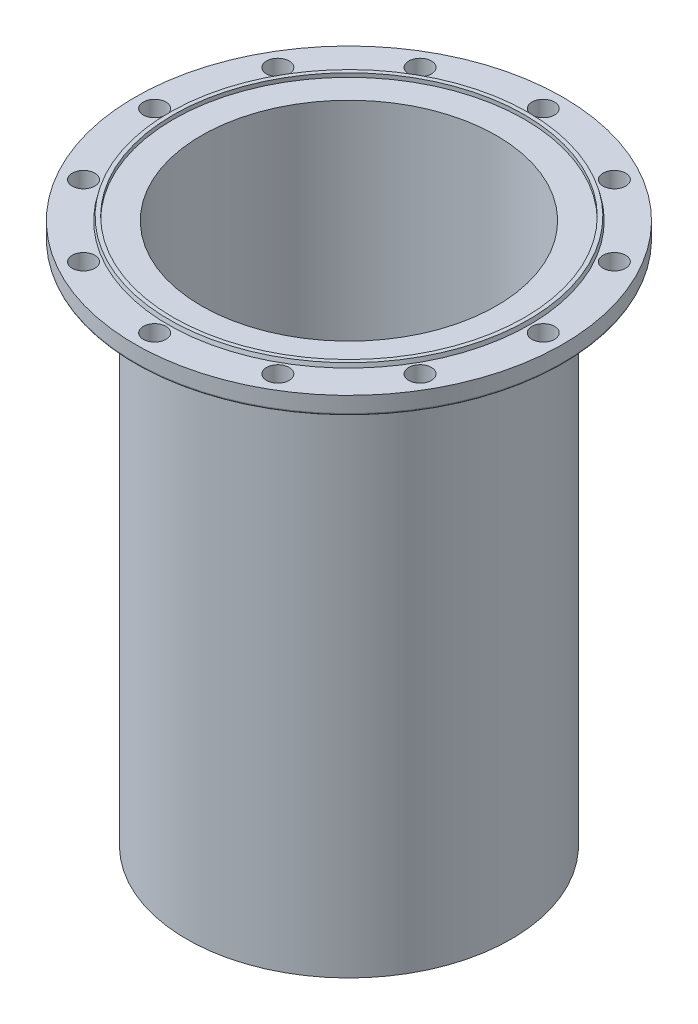
ISO-10303-21;
HEADER;
FILE_DESCRIPTION(('STEP AP214'),'2;1');
FILE_NAME('part.step','',(''),(''),'','','');
FILE_SCHEMA(('AUTOMOTIVE_DESIGN { 1 0 10303 214 1 1 1 1 }'));
ENDSEC;
DATA;
#1=APPLICATION_CONTEXT('core data for automotive mechanical design processes');
#2=APPLICATION_PROTOCOL_DEFINITION('international standard','automotive_design',2000,#1);
#3=PRODUCT_CONTEXT('',#1,'mechanical');
#4=PRODUCT('Part','Part','',(#3));
#5=PRODUCT_RELATED_PRODUCT_CATEGORY('part','',(#4));
#6=PRODUCT_DEFINITION_FORMATION('','',#4);
#7=PRODUCT_DEFINITION_CONTEXT('part definition',#1,'design');
#8=PRODUCT_DEFINITION('design','',#6,#7);
#9=PRODUCT_DEFINITION_SHAPE('','',#8);
#10=(LENGTH_UNIT() NAMED_UNIT(*) SI_UNIT(.MILLI.,.METRE.));
#11=(NAMED_UNIT(*) PLANE_ANGLE_UNIT() SI_UNIT($,.RADIAN.));
#12=(NAMED_UNIT(*) SI_UNIT($,.STERADIAN.) SOLID_ANGLE_UNIT());
#13=UNCERTAINTY_MEASURE_WITH_UNIT(LENGTH_MEASURE(1.E-05),#10,'distance_accuracy_value','');
#14=(GEOMETRIC_REPRESENTATION_CONTEXT(3) GLOBAL_UNCERTAINTY_ASSIGNED_CONTEXT((#13)) GLOBAL_UNIT_ASSIGNED_CONTEXT((#10,
#11,#12)) REPRESENTATION_CONTEXT('',''));
#15=CARTESIAN_POINT('',(0.,0.,0.));
#16=DIRECTION('',(0.,0.,1.));
#17=DIRECTION('',(1.,0.,0.));
#18=AXIS2_PLACEMENT_3D('',#15,#16,#17);
#19=CARTESIAN_POINT('',(-5.28893934632307,-9.28872093023256,0.));
#20=DIRECTION('',(0.,-1.,0.));
#21=DIRECTION('',(0.,0.,-1.));
#22=AXIS2_PLACEMENT_3D('',#19,#20,#21);
#23=CYLINDRICAL_SURFACE('',#22,150.);
#24=CARTESIAN_POINT('',(-5.28893934632307,40.7112790697674,0.));
#25=DIRECTION('',(0.,-1.,0.));
#26=DIRECTION('',(0.,0.,-1.));
#27=AXIS2_PLACEMENT_3D('',#24,#25,#26);
#28=CIRCLE('',#27,150.);
#29=CARTESIAN_POINT('',(-5.28893934632307,40.7112790697674,-150.));
#30=VERTEX_POINT('',#29);
#31=EDGE_CURVE('E10',#30,#30,#28,.T.);
#32=ORIENTED_EDGE('',*,*,#31,.F.);
#33=EDGE_LOOP('',(#32));
#34=FACE_BOUND('',#33,.T.);
#35=CARTESIAN_POINT('',(-5.28893934632307,-509.288720930233,0.));
#36=DIRECTION('',(0.,-1.,0.));
#37=DIRECTION('',(0.,0.,-1.));
#38=AXIS2_PLACEMENT_3D('',#35,#36,#37);
#39=CIRCLE('',#38,150.);
#40=CARTESIAN_POINT('',(-5.28893934632307,-509.288720930233,-150.));
#41=VERTEX_POINT('',#40);
#42=EDGE_CURVE('E256',#41,#41,#39,.T.);
#43=ORIENTED_EDGE('',*,*,#42,.T.);
#44=EDGE_LOOP('',(#43));
#45=FACE_BOUND('',#44,.T.);
#46=ADVANCED_FACE('F33',(#34,#45),#23,.F.);
#47=CARTESIAN_POINT('',(-155.288939346323,40.7112790697674,0.));
#48=DIRECTION('',(0.,-1.,0.));
#49=DIRECTION('',(0.,0.,-1.));
#50=AXIS2_PLACEMENT_3D('',#47,#48,#49);
#51=PLANE('',#50);
#52=CARTESIAN_POINT('',(-5.28893934632307,40.7112790697674,0.));
#53=DIRECTION('',(0.,-1.,0.));
#54=DIRECTION('',(0.,0.,-1.));
#55=AXIS2_PLACEMENT_3D('',#52,#53,#54);
#56=CIRCLE('',#55,178.5);
#57=CARTESIAN_POINT('',(-5.28893934632307,40.7112790697674,-178.5));
#58=VERTEX_POINT('',#57);
#59=EDGE_CURVE('E40',#58,#58,#56,.T.);
#60=ORIENTED_EDGE('',*,*,#59,.F.);
#61=EDGE_LOOP('',(#60));
#62=FACE_BOUND('',#61,.T.);
#63=ORIENTED_EDGE('',*,*,#31,.T.);
#64=EDGE_LOOP('',(#63));
#65=FACE_BOUND('',#64,.T.);
#66=ADVANCED_FACE('F153',(#62,#65),#51,.F.);
#67=CARTESIAN_POINT('',(-5.28893934632307,-9.28872093023256,0.));
#68=DIRECTION('',(0.,-1.,0.));
#69=DIRECTION('',(0.,0.,-1.));
#70=AXIS2_PLACEMENT_3D('',#67,#68,#69);
#71=CYLINDRICAL_SURFACE('',#70,178.5);
#72=CARTESIAN_POINT('',(-5.28893934632307,44.7112790697674,0.));
#73=DIRECTION('',(0.,-1.,0.));
#74=DIRECTION('',(0.,0.,-1.));
#75=AXIS2_PLACEMENT_3D('',#72,#73,#74);
#76=CIRCLE('',#75,178.5);
#77=CARTESIAN_POINT('',(-5.28893934632307,44.7112790697674,-178.5));
#78=VERTEX_POINT('',#77);
#79=EDGE_CURVE('E45',#78,#78,#76,.T.);
#80=ORIENTED_EDGE('',*,*,#79,.F.);
#81=EDGE_LOOP('',(#80));
#82=FACE_BOUND('',#81,.T.);
#83=ORIENTED_EDGE('',*,*,#59,.T.);
#84=EDGE_LOOP('',(#83));
#85=FACE_BOUND('',#84,.T.);
#86=ADVANCED_FACE('F150',(#82,#85),#71,.F.);
#87=CARTESIAN_POINT('',(-183.788939346323,44.7112790697674,0.));
#88=DIRECTION('',(0.,-1.,0.));
#89=DIRECTION('',(0.,0.,-1.));
#90=AXIS2_PLACEMENT_3D('',#87,#88,#89);
#91=PLANE('',#90);
#92=CARTESIAN_POINT('',(-5.28893934632307,44.7112790697674,0.));
#93=DIRECTION('',(0.,-1.,0.));
#94=DIRECTION('',(0.,0.,-1.));
#95=AXIS2_PLACEMENT_3D('',#92,#93,#94);
#96=CIRCLE('',#95,182.5);
#97=CARTESIAN_POINT('',(-5.28893934632307,44.7112790697674,-182.5));
#98=VERTEX_POINT('',#97);
#99=EDGE_CURVE('E143',#98,#98,#96,.T.);
#100=ORIENTED_EDGE('',*,*,#99,.F.);
#101=EDGE_LOOP('',(#100));
#102=FACE_BOUND('',#101,.T.);
#103=ORIENTED_EDGE('',*,*,#79,.T.);
#104=EDGE_LOOP('',(#103));
#105=FACE_BOUND('',#104,.T.);
#106=ADVANCED_FACE('F148',(#102,#105),#91,.F.);
#107=CARTESIAN_POINT('',(-5.28893934632307,44.7112790697674,0.));
#108=DIRECTION('',(0.,-1.,0.));
#109=DIRECTION('',(0.,0.,-1.));
#110=AXIS2_PLACEMENT_3D('',#107,#108,#109);
#111=CONICAL_SURFACE('',#110,182.5,0.244978663126865);
#112=CARTESIAN_POINT('',(-5.28893934632307,40.7112790697674,0.));
#113=DIRECTION('',(0.,-1.,0.));
#114=DIRECTION('',(0.,0.,-1.));
#115=AXIS2_PLACEMENT_3D('',#112,#113,#114);
#116=CIRCLE('',#115,183.5);
#117=CARTESIAN_POINT('',(-5.28893934632307,40.7112790697674,-183.5));
#118=VERTEX_POINT('',#117);
#119=EDGE_CURVE('E140',#118,#118,#116,.T.);
#120=ORIENTED_EDGE('',*,*,#119,.F.);
#121=EDGE_LOOP('',(#120));
#122=FACE_BOUND('',#121,.T.);
#123=ORIENTED_EDGE('',*,*,#99,.T.);
#124=EDGE_LOOP('',(#123));
#125=FACE_BOUND('',#124,.T.);
#126=ADVANCED_FACE('F165',(#122,#125),#111,.T.);
#127=CARTESIAN_POINT('',(-188.788939346323,40.7112790697674,0.));
#128=DIRECTION('',(0.,-1.,0.));
#129=DIRECTION('',(0.,0.,-1.));
#130=AXIS2_PLACEMENT_3D('',#127,#128,#129);
#131=PLANE('',#130);
#132=CARTESIAN_POINT('',(-176.32895659375,40.7112790697674,98.7500000000002));
#133=DIRECTION('',(0.,1.,0.));
#134=DIRECTION('',(0.,0.,1.));
#135=AXIS2_PLACEMENT_3D('',#132,#133,#134);
#136=CIRCLE('',#135,11.5);
#137=CARTESIAN_POINT('',(-176.32895659375,40.7112790697674,110.25));
#138=VERTEX_POINT('',#137);
#139=EDGE_CURVE('E101',#138,#138,#136,.T.);
#140=ORIENTED_EDGE('',*,*,#139,.F.);
#141=EDGE_LOOP('',(#140));
#142=FACE_BOUND('',#141,.T.);
#143=CARTESIAN_POINT('',(-104.038939346323,40.7112790697674,171.040017247427));
#144=DIRECTION('',(0.,1.,0.));
#145=DIRECTION('',(0.,0.,1.));
#146=AXIS2_PLACEMENT_3D('',#143,#144,#145);
#147=CIRCLE('',#146,11.5);
#148=CARTESIAN_POINT('',(-104.038939346323,40.7112790697674,182.540017247427));
#149=VERTEX_POINT('',#148);
#150=EDGE_CURVE('E91',#149,#149,#147,.T.);
#151=ORIENTED_EDGE('',*,*,#150,.F.);
#152=EDGE_LOOP('',(#151));
#153=FACE_BOUND('',#152,.T.);
#154=CARTESIAN_POINT('',(-5.28893934632304,40.7112790697674,197.5));
#155=DIRECTION('',(0.,1.,0.));
#156=DIRECTION('',(0.,0.,1.));
#157=AXIS2_PLACEMENT_3D('',#154,#155,#156);
#158=CIRCLE('',#157,11.5);
#159=CARTESIAN_POINT('',(-5.28893934632304,40.7112790697674,209.));
#160=VERTEX_POINT('',#159);
#161=EDGE_CURVE('E88',#160,#160,#158,.T.);
#162=ORIENTED_EDGE('',*,*,#161,.F.);
#163=EDGE_LOOP('',(#162));
#164=FACE_BOUND('',#163,.T.);
#165=CARTESIAN_POINT('',(93.461060653677,40.7112790697674,171.040017247427));
#166=DIRECTION('',(0.,1.,0.));
#167=DIRECTION('',(0.,0.,1.));
#168=AXIS2_PLACEMENT_3D('',#165,#166,#167);
#169=CIRCLE('',#168,11.5);
#170=CARTESIAN_POINT('',(93.461060653677,40.7112790697674,182.540017247427));
#171=VERTEX_POINT('',#170);
#172=EDGE_CURVE('E85',#171,#171,#169,.T.);
#173=ORIENTED_EDGE('',*,*,#172,.F.);
#174=EDGE_LOOP('',(#173));
#175=FACE_BOUND('',#174,.T.);
#176=CARTESIAN_POINT('',(165.751077901104,40.7112790697674,98.75));
#177=DIRECTION('',(0.,1.,0.));
#178=DIRECTION('',(0.,0.,1.));
#179=AXIS2_PLACEMENT_3D('',#176,#177,#178);
#180=CIRCLE('',#179,11.5);
#181=CARTESIAN_POINT('',(165.751077901104,40.7112790697674,110.25));
#182=VERTEX_POINT('',#181);
#183=EDGE_CURVE('E81',#182,#182,#180,.T.);
#184=ORIENTED_EDGE('',*,*,#183,.F.);
#185=EDGE_LOOP('',(#184));
#186=FACE_BOUND('',#185,.T.);
#187=CARTESIAN_POINT('',(192.211060653677,40.7112790697674,0.));
#188=DIRECTION('',(0.,1.,0.));
#189=DIRECTION('',(0.,0.,1.));
#190=AXIS2_PLACEMENT_3D('',#187,#188,#189);
#191=CIRCLE('',#190,11.5);
#192=CARTESIAN_POINT('',(192.211060653677,40.7112790697674,11.5));
#193=VERTEX_POINT('',#192);
#194=EDGE_CURVE('E77',#193,#193,#191,.T.);
#195=ORIENTED_EDGE('',*,*,#194,.F.);
#196=EDGE_LOOP('',(#195));
#197=FACE_BOUND('',#196,.T.);
#198=CARTESIAN_POINT('',(165.751077901104,40.7112790697674,-98.75));
#199=DIRECTION('',(0.,1.,0.));
#200=DIRECTION('',(0.,0.,1.));
#201=AXIS2_PLACEMENT_3D('',#198,#199,#200);
#202=CIRCLE('',#201,11.5);
#203=CARTESIAN_POINT('',(165.751077901104,40.7112790697674,-87.25));
#204=VERTEX_POINT('',#203);
#205=EDGE_CURVE('E73',#204,#204,#202,.T.);
#206=ORIENTED_EDGE('',*,*,#205,.F.);
#207=EDGE_LOOP('',(#206));
#208=FACE_BOUND('',#207,.T.);
#209=CARTESIAN_POINT('',(-5.28893934632309,40.7112790697674,-197.5));
#210=DIRECTION('',(0.,1.,0.));
#211=DIRECTION('',(0.,0.,1.));
#212=AXIS2_PLACEMENT_3D('',#209,#210,#211);
#213=CIRCLE('',#212,11.5);
#214=CARTESIAN_POINT('',(-5.28893934632309,40.7112790697674,-186.));
#215=VERTEX_POINT('',#214);
#216=EDGE_CURVE('E69',#215,#215,#213,.T.);
#217=ORIENTED_EDGE('',*,*,#216,.F.);
#218=EDGE_LOOP('',(#217));
#219=FACE_BOUND('',#218,.T.);
#220=CARTESIAN_POINT('',(-104.038939346323,40.7112790697674,-171.040017247427));
#221=DIRECTION('',(0.,1.,0.));
#222=DIRECTION('',(0.,0.,1.));
#223=AXIS2_PLACEMENT_3D('',#220,#221,#222);
#224=CIRCLE('',#223,11.5);
#225=CARTESIAN_POINT('',(-104.038939346323,40.7112790697674,-159.540017247427));
#226=VERTEX_POINT('',#225);
#227=EDGE_CURVE('E65',#226,#226,#224,.T.);
#228=ORIENTED_EDGE('',*,*,#227,.F.);
#229=EDGE_LOOP('',(#228));
#230=FACE_BOUND('',#229,.T.);
#231=CARTESIAN_POINT('',(-176.32895659375,40.7112790697674,-98.75));
#232=DIRECTION('',(0.,1.,0.));
#233=DIRECTION('',(0.,0.,1.));
#234=AXIS2_PLACEMENT_3D('',#231,#232,#233);
#235=CIRCLE('',#234,11.5);
#236=CARTESIAN_POINT('',(-176.32895659375,40.7112790697674,-87.25));
#237=VERTEX_POINT('',#236);
#238=EDGE_CURVE('E61',#237,#237,#235,.T.);
#239=ORIENTED_EDGE('',*,*,#238,.F.);
#240=EDGE_LOOP('',(#239));
#241=FACE_BOUND('',#240,.T.);
#242=CARTESIAN_POINT('',(93.4610606536769,40.7112790697674,-171.040017247427));
#243=DIRECTION('',(0.,1.,0.));
#244=DIRECTION('',(0.,0.,1.));
#245=AXIS2_PLACEMENT_3D('',#242,#243,#244);
#246=CIRCLE('',#245,11.5);
#247=CARTESIAN_POINT('',(93.4610606536769,40.7112790697674,-159.540017247427));
#248=VERTEX_POINT('',#247);
#249=EDGE_CURVE('E57',#248,#248,#246,.T.);
#250=ORIENTED_EDGE('',*,*,#249,.F.);
#251=EDGE_LOOP('',(#250));
#252=FACE_BOUND('',#251,.T.);
#253=CARTESIAN_POINT('',(-202.788939346323,40.7112790697674,0.));
#254=DIRECTION('',(0.,1.,0.));
#255=DIRECTION('',(0.,0.,1.));
#256=AXIS2_PLACEMENT_3D('',#253,#254,#255);
#257=CIRCLE('',#256,11.5);
#258=CARTESIAN_POINT('',(-202.788939346323,40.7112790697674,11.5000000000001));
#259=VERTEX_POINT('',#258);
#260=EDGE_CURVE('E53',#259,#259,#257,.T.);
#261=ORIENTED_EDGE('',*,*,#260,.F.);
#262=EDGE_LOOP('',(#261));
#263=FACE_BOUND('',#262,.T.);
#264=CARTESIAN_POINT('',(-5.28893934632307,40.7112790697674,0.));
#265=DIRECTION('',(0.,-1.,0.));
#266=DIRECTION('',(0.,0.,-1.));
#267=AXIS2_PLACEMENT_3D('',#264,#265,#266);
#268=CIRCLE('',#267,217.5);
#269=CARTESIAN_POINT('',(-5.28893934632307,40.7112790697674,-217.5));
#270=VERTEX_POINT('',#269);
#271=EDGE_CURVE('E137',#270,#270,#268,.T.);
#272=ORIENTED_EDGE('',*,*,#271,.F.);
#273=EDGE_LOOP('',(#272));
#274=FACE_BOUND('',#273,.T.);
#275=ORIENTED_EDGE('',*,*,#119,.T.);
#276=EDGE_LOOP('',(#275));
#277=FACE_BOUND('',#276,.T.);
#278=ADVANCED_FACE('F169',(#142,#153,#164,#175,#186,#197,#208,#219,#230,#241,#252,#263,#274,
#277),#131,.F.);
#279=CARTESIAN_POINT('',(-5.28893934632307,-9.28872093023256,0.));
#280=DIRECTION('',(0.,-1.,0.));
#281=DIRECTION('',(0.,0.,-1.));
#282=AXIS2_PLACEMENT_3D('',#279,#280,#281);
#283=CYLINDRICAL_SURFACE('',#282,217.5);
#284=CARTESIAN_POINT('',(-5.28893934632307,24.7112790697674,0.));
#285=DIRECTION('',(0.,-1.,0.));
#286=DIRECTION('',(0.,0.,-1.));
#287=AXIS2_PLACEMENT_3D('',#284,#285,#286);
#288=CIRCLE('',#287,217.5);
#289=CARTESIAN_POINT('',(-5.28893934632307,24.7112790697674,-217.5));
#290=VERTEX_POINT('',#289);
#291=EDGE_CURVE('E134',#290,#290,#288,.T.);
#292=ORIENTED_EDGE('',*,*,#291,.F.);
#293=EDGE_LOOP('',(#292));
#294=FACE_BOUND('',#293,.T.);
#295=ORIENTED_EDGE('',*,*,#271,.T.);
#296=EDGE_LOOP('',(#295));
#297=FACE_BOUND('',#296,.T.);
#298=ADVANCED_FACE('F173',(#294,#297),#283,.T.);
#299=CARTESIAN_POINT('',(-5.28893934632307,24.7112790697674,0.));
#300=DIRECTION('',(0.,-1.,0.));
#301=DIRECTION('',(0.,0.,-1.));
#302=AXIS2_PLACEMENT_3D('',#299,#300,#301);
#303=TOROIDAL_SURFACE('',#302,215.5,2.00000000000001);
#304=CARTESIAN_POINT('',(-5.28893934632307,22.7112790697674,0.));
#305=DIRECTION('',(0.,-1.,0.));
#306=DIRECTION('',(0.,0.,-1.));
#307=AXIS2_PLACEMENT_3D('',#304,#305,#306);
#308=CIRCLE('',#307,215.5);
#309=CARTESIAN_POINT('',(-5.28893934632307,22.7112790697674,-215.5));
#310=VERTEX_POINT('',#309);
#311=EDGE_CURVE('E131',#310,#310,#308,.T.);
#312=ORIENTED_EDGE('',*,*,#311,.F.);
#313=EDGE_LOOP('',(#312));
#314=FACE_BOUND('',#313,.T.);
#315=ORIENTED_EDGE('',*,*,#291,.T.);
#316=EDGE_LOOP('',(#315));
#317=FACE_BOUND('',#316,.T.);
#318=ADVANCED_FACE('F177',(#314,#317),#303,.T.);
#319=CARTESIAN_POINT('',(-220.788939346323,22.7112790697674,0.));
#320=DIRECTION('',(0.,1.,0.));
#321=DIRECTION('',(0.,0.,1.));
#322=AXIS2_PLACEMENT_3D('',#319,#320,#321);
#323=PLANE('',#322);
#324=CARTESIAN_POINT('',(-176.32895659375,22.7112790697674,98.7500000000002));
#325=DIRECTION('',(0.,1.,0.));
#326=DIRECTION('',(0.,0.,1.));
#327=AXIS2_PLACEMENT_3D('',#324,#325,#326);
#328=CIRCLE('',#327,11.5);
#329=CARTESIAN_POINT('',(-176.32895659375,22.7112790697674,110.25));
#330=VERTEX_POINT('',#329);
#331=EDGE_CURVE('E36',#330,#330,#328,.T.);
#332=ORIENTED_EDGE('',*,*,#331,.T.);
#333=EDGE_LOOP('',(#332));
#334=FACE_BOUND('',#333,.T.);
#335=CARTESIAN_POINT('',(-104.038939346323,22.7112790697674,171.040017247427));
#336=DIRECTION('',(0.,1.,0.));
#337=DIRECTION('',(0.,0.,1.));
#338=AXIS2_PLACEMENT_3D('',#335,#336,#337);
#339=CIRCLE('',#338,11.5);
#340=CARTESIAN_POINT('',(-104.038939346323,22.7112790697674,182.540017247427));
#341=VERTEX_POINT('',#340);
#342=EDGE_CURVE('E89',#341,#341,#339,.T.);
#343=ORIENTED_EDGE('',*,*,#342,.T.);
#344=EDGE_LOOP('',(#343));
#345=FACE_BOUND('',#344,.T.);
#346=CARTESIAN_POINT('',(-5.28893934632304,22.7112790697674,197.5));
#347=DIRECTION('',(0.,1.,0.));
#348=DIRECTION('',(0.,0.,1.));
#349=AXIS2_PLACEMENT_3D('',#346,#347,#348);
#350=CIRCLE('',#349,11.5);
#351=CARTESIAN_POINT('',(-5.28893934632304,22.7112790697674,209.));
#352=VERTEX_POINT('',#351);
#353=EDGE_CURVE('E86',#352,#352,#350,.T.);
#354=ORIENTED_EDGE('',*,*,#353,.T.);
#355=EDGE_LOOP('',(#354));
#356=FACE_BOUND('',#355,.T.);
#357=CARTESIAN_POINT('',(93.461060653677,22.7112790697674,171.040017247427));
#358=DIRECTION('',(0.,1.,0.));
#359=DIRECTION('',(0.,0.,1.));
#360=AXIS2_PLACEMENT_3D('',#357,#358,#359);
#361=CIRCLE('',#360,11.5);
#362=CARTESIAN_POINT('',(93.461060653677,22.7112790697674,182.540017247427));
#363=VERTEX_POINT('',#362);
#364=EDGE_CURVE('E82',#363,#363,#361,.T.);
#365=ORIENTED_EDGE('',*,*,#364,.T.);
#366=EDGE_LOOP('',(#365));
#367=FACE_BOUND('',#366,.T.);
#368=CARTESIAN_POINT('',(165.751077901104,22.7112790697674,98.75));
#369=DIRECTION('',(0.,1.,0.));
#370=DIRECTION('',(0.,0.,1.));
#371=AXIS2_PLACEMENT_3D('',#368,#369,#370);
#372=CIRCLE('',#371,11.5);
#373=CARTESIAN_POINT('',(165.751077901104,22.7112790697674,110.25));
#374=VERTEX_POINT('',#373);
#375=EDGE_CURVE('E78',#374,#374,#372,.T.);
#376=ORIENTED_EDGE('',*,*,#375,.T.);
#377=EDGE_LOOP('',(#376));
#378=FACE_BOUND('',#377,.T.);
#379=CARTESIAN_POINT('',(192.211060653677,22.7112790697674,0.));
#380=DIRECTION('',(0.,1.,0.));
#381=DIRECTION('',(0.,0.,1.));
#382=AXIS2_PLACEMENT_3D('',#379,#380,#381);
#383=CIRCLE('',#382,11.5);
#384=CARTESIAN_POINT('',(192.211060653677,22.7112790697674,11.5));
#385=VERTEX_POINT('',#384);
#386=EDGE_CURVE('E74',#385,#385,#383,.T.);
#387=ORIENTED_EDGE('',*,*,#386,.T.);
#388=EDGE_LOOP('',(#387));
#389=FACE_BOUND('',#388,.T.);
#390=CARTESIAN_POINT('',(165.751077901104,22.7112790697674,-98.75));
#391=DIRECTION('',(0.,1.,0.));
#392=DIRECTION('',(0.,0.,1.));
#393=AXIS2_PLACEMENT_3D('',#390,#391,#392);
#394=CIRCLE('',#393,11.5);
#395=CARTESIAN_POINT('',(165.751077901104,22.7112790697674,-87.25));
#396=VERTEX_POINT('',#395);
#397=EDGE_CURVE('E70',#396,#396,#394,.T.);
#398=ORIENTED_EDGE('',*,*,#397,.T.);
#399=EDGE_LOOP('',(#398));
#400=FACE_BOUND('',#399,.T.);
#401=CARTESIAN_POINT('',(-5.28893934632309,22.7112790697674,-197.5));
#402=DIRECTION('',(0.,1.,0.));
#403=DIRECTION('',(0.,0.,1.));
#404=AXIS2_PLACEMENT_3D('',#401,#402,#403);
#405=CIRCLE('',#404,11.5);
#406=CARTESIAN_POINT('',(-5.28893934632309,22.7112790697674,-186.));
#407=VERTEX_POINT('',#406);
#408=EDGE_CURVE('E66',#407,#407,#405,.T.);
#409=ORIENTED_EDGE('',*,*,#408,.T.);
#410=EDGE_LOOP('',(#409));
#411=FACE_BOUND('',#410,.T.);
#412=CARTESIAN_POINT('',(-104.038939346323,22.7112790697674,-171.040017247427));
#413=DIRECTION('',(0.,1.,0.));
#414=DIRECTION('',(0.,0.,1.));
#415=AXIS2_PLACEMENT_3D('',#412,#413,#414);
#416=CIRCLE('',#415,11.5);
#417=CARTESIAN_POINT('',(-104.038939346323,22.7112790697674,-159.540017247427));
#418=VERTEX_POINT('',#417);
#419=EDGE_CURVE('E62',#418,#418,#416,.T.);
#420=ORIENTED_EDGE('',*,*,#419,.T.);
#421=EDGE_LOOP('',(#420));
#422=FACE_BOUND('',#421,.T.);
#423=CARTESIAN_POINT('',(-176.32895659375,22.7112790697674,-98.75));
#424=DIRECTION('',(0.,1.,0.));
#425=DIRECTION('',(0.,0.,1.));
#426=AXIS2_PLACEMENT_3D('',#423,#424,#425);
#427=CIRCLE('',#426,11.5);
#428=CARTESIAN_POINT('',(-176.32895659375,22.7112790697674,-87.25));
#429=VERTEX_POINT('',#428);
#430=EDGE_CURVE('E58',#429,#429,#427,.T.);
#431=ORIENTED_EDGE('',*,*,#430,.T.);
#432=EDGE_LOOP('',(#431));
#433=FACE_BOUND('',#432,.T.);
#434=CARTESIAN_POINT('',(93.4610606536769,22.7112790697674,-171.040017247427));
#435=DIRECTION('',(0.,1.,0.));
#436=DIRECTION('',(0.,0.,1.));
#437=AXIS2_PLACEMENT_3D('',#434,#435,#436);
#438=CIRCLE('',#437,11.5);
#439=CARTESIAN_POINT('',(93.4610606536769,22.7112790697674,-159.540017247427));
#440=VERTEX_POINT('',#439);
#441=EDGE_CURVE('E54',#440,#440,#438,.T.);
#442=ORIENTED_EDGE('',*,*,#441,.T.);
#443=EDGE_LOOP('',(#442));
#444=FACE_BOUND('',#443,.T.);
#445=CARTESIAN_POINT('',(-202.788939346323,22.7112790697674,0.));
#446=DIRECTION('',(0.,1.,0.));
#447=DIRECTION('',(0.,0.,1.));
#448=AXIS2_PLACEMENT_3D('',#445,#446,#447);
#449=CIRCLE('',#448,11.5);
#450=CARTESIAN_POINT('',(-202.788939346323,22.7112790697674,11.5000000000001));
#451=VERTEX_POINT('',#450);
#452=EDGE_CURVE('E49',#451,#451,#449,.T.);
#453=ORIENTED_EDGE('',*,*,#452,.T.);
#454=EDGE_LOOP('',(#453));
#455=FACE_BOUND('',#454,.T.);
#456=CARTESIAN_POINT('',(-5.28893934632307,22.7112790697674,0.));
#457=DIRECTION('',(0.,-1.,0.));
#458=DIRECTION('',(0.,0.,-1.));
#459=AXIS2_PLACEMENT_3D('',#456,#457,#458);
#460=CIRCLE('',#459,175.991183949057);
#461=CARTESIAN_POINT('',(-5.28893934632307,22.7112790697674,-175.991183949057));
#462=VERTEX_POINT('',#461);
#463=EDGE_CURVE('E128',#462,#462,#460,.T.);
#464=ORIENTED_EDGE('',*,*,#463,.F.);
#465=EDGE_LOOP('',(#464));
#466=FACE_BOUND('',#465,.T.);
#467=ORIENTED_EDGE('',*,*,#311,.T.);
#468=EDGE_LOOP('',(#467));
#469=FACE_BOUND('',#468,.T.);
#470=ADVANCED_FACE('F181',(#334,#345,#356,#367,#378,#389,#400,#411,#422,#433,#444,#455,#466,
#469),#323,.F.);
#471=CARTESIAN_POINT('',(-5.28893934632307,15.7112790697674,0.));
#472=DIRECTION('',(0.,-1.,0.));
#473=DIRECTION('',(0.,0.,-1.));
#474=AXIS2_PLACEMENT_3D('',#471,#472,#473);
#475=TOROIDAL_SURFACE('',#474,175.991183949057,6.99999999999999);
#476=CARTESIAN_POINT('',(-5.28893934632307,16.7919172316827,0.));
#477=DIRECTION('',(0.,-1.,0.));
#478=DIRECTION('',(0.,0.,-1.));
#479=AXIS2_PLACEMENT_3D('',#476,#477,#478);
#480=CIRCLE('',#479,169.075099712799);
#481=CARTESIAN_POINT('',(-5.28893934632307,16.7919172316827,-169.075099712799));
#482=VERTEX_POINT('',#481);
#483=EDGE_CURVE('E125',#482,#482,#480,.T.);
#484=ORIENTED_EDGE('',*,*,#483,.F.);
#485=EDGE_LOOP('',(#484));
#486=FACE_BOUND('',#485,.T.);
#487=ORIENTED_EDGE('',*,*,#463,.T.);
#488=EDGE_LOOP('',(#487));
#489=FACE_BOUND('',#488,.T.);
#490=ADVANCED_FACE('F185',(#486,#489),#475,.F.);
#491=CARTESIAN_POINT('',(-5.28893934632307,16.7919172316827,0.));
#492=DIRECTION('',(0.,1.,0.));
#493=DIRECTION('',(0.,0.,1.));
#494=AXIS2_PLACEMENT_3D('',#491,#492,#493);
#495=CONICAL_SURFACE('',#494,169.075099712799,0.154996741923942);
#496=CARTESIAN_POINT('',(-5.28893934632307,-9.28872093023256,0.));
#497=DIRECTION('',(0.,-1.,0.));
#498=DIRECTION('',(0.,0.,-1.));
#499=AXIS2_PLACEMENT_3D('',#496,#497,#498);
#500=CIRCLE('',#499,165.);
#501=CARTESIAN_POINT('',(-5.28893934632307,-9.28872093023256,-165.));
#502=VERTEX_POINT('',#501);
#503=EDGE_CURVE('E52',#502,#502,#500,.T.);
#504=ORIENTED_EDGE('',*,*,#503,.F.);
#505=EDGE_LOOP('',(#504));
#506=FACE_BOUND('',#505,.T.);
#507=ORIENTED_EDGE('',*,*,#483,.T.);
#508=EDGE_LOOP('',(#507));
#509=FACE_BOUND('',#508,.T.);
#510=ADVANCED_FACE('F189',(#506,#509),#495,.T.);
#511=CARTESIAN_POINT('',(-202.788939346323,-9.28872093023256,0.));
#512=DIRECTION('',(0.,1.,0.));
#513=DIRECTION('',(0.,0.,1.));
#514=AXIS2_PLACEMENT_3D('',#511,#512,#513);
#515=CYLINDRICAL_SURFACE('',#514,11.5);
#516=ORIENTED_EDGE('',*,*,#260,.T.);
#517=EDGE_LOOP('',(#516));
#518=FACE_BOUND('',#517,.T.);
#519=ORIENTED_EDGE('',*,*,#452,.F.);
#520=EDGE_LOOP('',(#519));
#521=FACE_BOUND('',#520,.T.);
#522=ADVANCED_FACE('F193',(#518,#521),#515,.F.);
#523=CARTESIAN_POINT('',(93.4610606536769,-9.28872093023256,-171.040017247427));
#524=DIRECTION('',(0.,1.,0.));
#525=DIRECTION('',(0.,0.,1.));
#526=AXIS2_PLACEMENT_3D('',#523,#524,#525);
#527=CYLINDRICAL_SURFACE('',#526,11.5);
#528=ORIENTED_EDGE('',*,*,#249,.T.);
#529=EDGE_LOOP('',(#528));
#530=FACE_BOUND('',#529,.T.);
#531=ORIENTED_EDGE('',*,*,#441,.F.);
#532=EDGE_LOOP('',(#531));
#533=FACE_BOUND('',#532,.T.);
#534=ADVANCED_FACE('F197',(#530,#533),#527,.F.);
#535=CARTESIAN_POINT('',(-176.32895659375,-9.28872093023256,-98.75));
#536=DIRECTION('',(0.,1.,0.));
#537=DIRECTION('',(0.,0.,1.));
#538=AXIS2_PLACEMENT_3D('',#535,#536,#537);
#539=CYLINDRICAL_SURFACE('',#538,11.5);
#540=ORIENTED_EDGE('',*,*,#238,.T.);
#541=EDGE_LOOP('',(#540));
#542=FACE_BOUND('',#541,.T.);
#543=ORIENTED_EDGE('',*,*,#430,.F.);
#544=EDGE_LOOP('',(#543));
#545=FACE_BOUND('',#544,.T.);
#546=ADVANCED_FACE('F201',(#542,#545),#539,.F.);
#547=CARTESIAN_POINT('',(-104.038939346323,-9.28872093023256,-171.040017247427));
#548=DIRECTION('',(0.,1.,0.));
#549=DIRECTION('',(0.,0.,1.));
#550=AXIS2_PLACEMENT_3D('',#547,#548,#549);
#551=CYLINDRICAL_SURFACE('',#550,11.5);
#552=ORIENTED_EDGE('',*,*,#227,.T.);
#553=EDGE_LOOP('',(#552));
#554=FACE_BOUND('',#553,.T.);
#555=ORIENTED_EDGE('',*,*,#419,.F.);
#556=EDGE_LOOP('',(#555));
#557=FACE_BOUND('',#556,.T.);
#558=ADVANCED_FACE('F205',(#554,#557),#551,.F.);
#559=CARTESIAN_POINT('',(-5.28893934632309,-9.28872093023256,-197.5));
#560=DIRECTION('',(0.,1.,0.));
#561=DIRECTION('',(0.,0.,1.));
#562=AXIS2_PLACEMENT_3D('',#559,#560,#561);
#563=CYLINDRICAL_SURFACE('',#562,11.5);
#564=ORIENTED_EDGE('',*,*,#216,.T.);
#565=EDGE_LOOP('',(#564));
#566=FACE_BOUND('',#565,.T.);
#567=ORIENTED_EDGE('',*,*,#408,.F.);
#568=EDGE_LOOP('',(#567));
#569=FACE_BOUND('',#568,.T.);
#570=ADVANCED_FACE('F209',(#566,#569),#563,.F.);
#571=CARTESIAN_POINT('',(165.751077901104,-9.28872093023256,-98.75));
#572=DIRECTION('',(0.,1.,0.));
#573=DIRECTION('',(0.,0.,1.));
#574=AXIS2_PLACEMENT_3D('',#571,#572,#573);
#575=CYLINDRICAL_SURFACE('',#574,11.5);
#576=ORIENTED_EDGE('',*,*,#205,.T.);
#577=EDGE_LOOP('',(#576));
#578=FACE_BOUND('',#577,.T.);
#579=ORIENTED_EDGE('',*,*,#397,.F.);
#580=EDGE_LOOP('',(#579));
#581=FACE_BOUND('',#580,.T.);
#582=ADVANCED_FACE('F213',(#578,#581),#575,.F.);
#583=CARTESIAN_POINT('',(192.211060653677,-9.28872093023256,0.));
#584=DIRECTION('',(0.,1.,0.));
#585=DIRECTION('',(0.,0.,1.));
#586=AXIS2_PLACEMENT_3D('',#583,#584,#585);
#587=CYLINDRICAL_SURFACE('',#586,11.5);
#588=ORIENTED_EDGE('',*,*,#194,.T.);
#589=EDGE_LOOP('',(#588));
#590=FACE_BOUND('',#589,.T.);
#591=ORIENTED_EDGE('',*,*,#386,.F.);
#592=EDGE_LOOP('',(#591));
#593=FACE_BOUND('',#592,.T.);
#594=ADVANCED_FACE('F217',(#590,#593),#587,.F.);
#595=CARTESIAN_POINT('',(165.751077901104,-9.28872093023256,98.75));
#596=DIRECTION('',(0.,1.,0.));
#597=DIRECTION('',(0.,0.,1.));
#598=AXIS2_PLACEMENT_3D('',#595,#596,#597);
#599=CYLINDRICAL_SURFACE('',#598,11.5);
#600=ORIENTED_EDGE('',*,*,#183,.T.);
#601=EDGE_LOOP('',(#600));
#602=FACE_BOUND('',#601,.T.);
#603=ORIENTED_EDGE('',*,*,#375,.F.);
#604=EDGE_LOOP('',(#603));
#605=FACE_BOUND('',#604,.T.);
#606=ADVANCED_FACE('F221',(#602,#605),#599,.F.);
#607=CARTESIAN_POINT('',(93.461060653677,-9.28872093023256,171.040017247427));
#608=DIRECTION('',(0.,1.,0.));
#609=DIRECTION('',(0.,0.,1.));
#610=AXIS2_PLACEMENT_3D('',#607,#608,#609);
#611=CYLINDRICAL_SURFACE('',#610,11.5);
#612=ORIENTED_EDGE('',*,*,#172,.T.);
#613=EDGE_LOOP('',(#612));
#614=FACE_BOUND('',#613,.T.);
#615=ORIENTED_EDGE('',*,*,#364,.F.);
#616=EDGE_LOOP('',(#615));
#617=FACE_BOUND('',#616,.T.);
#618=ADVANCED_FACE('F225',(#614,#617),#611,.F.);
#619=CARTESIAN_POINT('',(-5.28893934632304,-9.28872093023256,197.5));
#620=DIRECTION('',(0.,1.,0.));
#621=DIRECTION('',(0.,0.,1.));
#622=AXIS2_PLACEMENT_3D('',#619,#620,#621);
#623=CYLINDRICAL_SURFACE('',#622,11.5);
#624=ORIENTED_EDGE('',*,*,#161,.T.);
#625=EDGE_LOOP('',(#624));
#626=FACE_BOUND('',#625,.T.);
#627=ORIENTED_EDGE('',*,*,#353,.F.);
#628=EDGE_LOOP('',(#627));
#629=FACE_BOUND('',#628,.T.);
#630=ADVANCED_FACE('F229',(#626,#629),#623,.F.);
#631=CARTESIAN_POINT('',(-104.038939346323,-9.28872093023256,171.040017247427));
#632=DIRECTION('',(0.,1.,0.));
#633=DIRECTION('',(0.,0.,1.));
#634=AXIS2_PLACEMENT_3D('',#631,#632,#633);
#635=CYLINDRICAL_SURFACE('',#634,11.5);
#636=ORIENTED_EDGE('',*,*,#150,.T.);
#637=EDGE_LOOP('',(#636));
#638=FACE_BOUND('',#637,.T.);
#639=ORIENTED_EDGE('',*,*,#342,.F.);
#640=EDGE_LOOP('',(#639));
#641=FACE_BOUND('',#640,.T.);
#642=ADVANCED_FACE('F233',(#638,#641),#635,.F.);
#643=CARTESIAN_POINT('',(-176.32895659375,-9.28872093023256,98.7500000000002));
#644=DIRECTION('',(0.,1.,0.));
#645=DIRECTION('',(0.,0.,1.));
#646=AXIS2_PLACEMENT_3D('',#643,#644,#645);
#647=CYLINDRICAL_SURFACE('',#646,11.5);
#648=ORIENTED_EDGE('',*,*,#139,.T.);
#649=EDGE_LOOP('',(#648));
#650=FACE_BOUND('',#649,.T.);
#651=ORIENTED_EDGE('',*,*,#331,.F.);
#652=EDGE_LOOP('',(#651));
#653=FACE_BOUND('',#652,.T.);
#654=ADVANCED_FACE('F237',(#650,#653),#647,.F.);
#655=CARTESIAN_POINT('',(-5.28893934632307,-509.288720930233,0.));
#656=DIRECTION('',(0.,-1.,0.));
#657=DIRECTION('',(0.,0.,-1.));
#658=AXIS2_PLACEMENT_3D('',#655,#656,#657);
#659=PLANE('',#658);
#660=CARTESIAN_POINT('',(-5.28893934632307,-509.288720930233,0.));
#661=DIRECTION('',(0.,-1.,0.));
#662=DIRECTION('',(0.,0.,-1.));
#663=AXIS2_PLACEMENT_3D('',#660,#661,#662);
#664=CIRCLE('',#663,165.);
#665=CARTESIAN_POINT('',(-5.28893934632307,-509.288720930233,-165.));
#666=VERTEX_POINT('',#665);
#667=EDGE_CURVE('E253',#666,#666,#664,.T.);
#668=ORIENTED_EDGE('',*,*,#667,.T.);
#669=EDGE_LOOP('',(#668));
#670=FACE_BOUND('',#669,.T.);
#671=ORIENTED_EDGE('',*,*,#42,.F.);
#672=EDGE_LOOP('',(#671));
#673=FACE_BOUND('',#672,.T.);
#674=ADVANCED_FACE('F240',(#670,#673),#659,.T.);
#675=CARTESIAN_POINT('',(-5.28893934632307,-509.288720930233,0.));
#676=DIRECTION('',(0.,1.,0.));
#677=DIRECTION('',(0.,0.,1.));
#678=AXIS2_PLACEMENT_3D('',#675,#676,#677);
#679=CYLINDRICAL_SURFACE('',#678,165.);
#680=ORIENTED_EDGE('',*,*,#667,.F.);
#681=EDGE_LOOP('',(#680));
#682=FACE_BOUND('',#681,.T.);
#683=ORIENTED_EDGE('',*,*,#503,.T.);
#684=EDGE_LOOP('',(#683));
#685=FACE_BOUND('',#684,.T.);
#686=ADVANCED_FACE('F242',(#682,#685),#679,.T.);
#687=CLOSED_SHELL('',(#46,#66,#86,#106,#126,#278,#298,#318,#470,#490,#510,#522,#534,#546,#558,
#570,#582,#594,#606,#618,#630,#642,#654,#674,#686));
#688=MANIFOLD_SOLID_BREP('B2',#687);
#689=ADVANCED_BREP_SHAPE_REPRESENTATION('',(#18,#688),#14);
#690=SHAPE_DEFINITION_REPRESENTATION(#9,#689);
ENDSEC;
END-ISO-10303-21;
